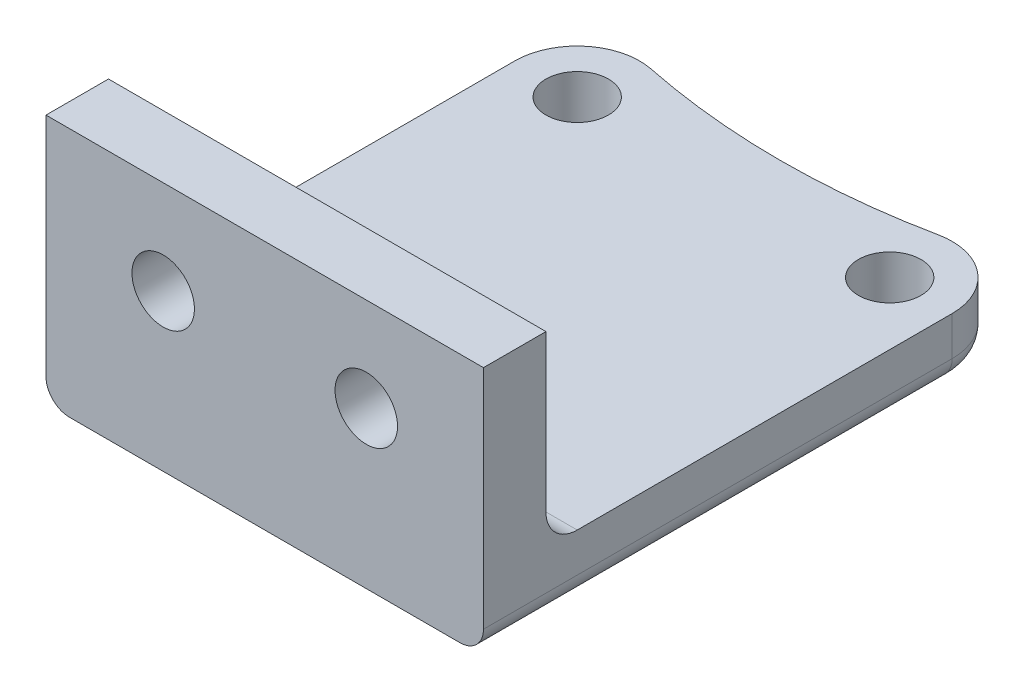
ISO-10303-21;
HEADER;
FILE_DESCRIPTION(('STEP AP214'),'2;1');
FILE_NAME('part.step','',(''),(''),'','','');
FILE_SCHEMA(('AUTOMOTIVE_DESIGN { 1 0 10303 214 1 1 1 1 }'));
ENDSEC;
DATA;
#1=APPLICATION_CONTEXT('core data for automotive mechanical design processes');
#2=APPLICATION_PROTOCOL_DEFINITION('international standard','automotive_design',2000,#1);
#3=PRODUCT_CONTEXT('',#1,'mechanical');
#4=PRODUCT('Part','Part','',(#3));
#5=PRODUCT_RELATED_PRODUCT_CATEGORY('part','',(#4));
#6=PRODUCT_DEFINITION_FORMATION('','',#4);
#7=PRODUCT_DEFINITION_CONTEXT('part definition',#1,'design');
#8=PRODUCT_DEFINITION('design','',#6,#7);
#9=PRODUCT_DEFINITION_SHAPE('','',#8);
#10=(LENGTH_UNIT() NAMED_UNIT(*) SI_UNIT(.MILLI.,.METRE.));
#11=(NAMED_UNIT(*) PLANE_ANGLE_UNIT() SI_UNIT($,.RADIAN.));
#12=(NAMED_UNIT(*) SI_UNIT($,.STERADIAN.) SOLID_ANGLE_UNIT());
#13=UNCERTAINTY_MEASURE_WITH_UNIT(LENGTH_MEASURE(1.E-05),#10,'distance_accuracy_value','');
#14=(GEOMETRIC_REPRESENTATION_CONTEXT(3) GLOBAL_UNCERTAINTY_ASSIGNED_CONTEXT((#13)) GLOBAL_UNIT_ASSIGNED_CONTEXT((#10,
#11,#12)) REPRESENTATION_CONTEXT('',''));
#15=CARTESIAN_POINT('',(0.,0.,0.));
#16=DIRECTION('',(0.,0.,1.));
#17=DIRECTION('',(1.,0.,0.));
#18=AXIS2_PLACEMENT_3D('',#15,#16,#17);
#19=CARTESIAN_POINT('',(10.,4.,-48.7662963080753));
#20=DIRECTION('',(0.,1.,0.));
#21=DIRECTION('',(0.,0.,-1.));
#22=AXIS2_PLACEMENT_3D('',#19,#20,#21);
#23=PLANE('',#22);
#24=DIRECTION('',(0.,0.,1.));
#25=VECTOR('',#24,1.);
#26=CARTESIAN_POINT('',(24.,4.,30.));
#27=LINE('',#26,#25);
#28=CARTESIAN_POINT('',(24.,4.,0.));
#29=VERTEX_POINT('',#28);
#30=CARTESIAN_POINT('',(24.,4.,24.));
#31=VERTEX_POINT('',#30);
#32=EDGE_CURVE('E182',#29,#31,#27,.T.);
#33=ORIENTED_EDGE('',*,*,#32,.F.);
#34=CARTESIAN_POINT('',(20.,4.,0.));
#35=DIRECTION('',(0.,-1.,0.));
#36=DIRECTION('',(0.,0.,-1.));
#37=AXIS2_PLACEMENT_3D('',#34,#35,#36);
#38=CIRCLE('',#37,4.);
#39=CARTESIAN_POINT('',(19.1964811839347,4.,-3.91846366733558));
#40=VERTEX_POINT('',#39);
#41=EDGE_CURVE('E179',#40,#29,#38,.T.);
#42=ORIENTED_EDGE('',*,*,#41,.F.);
#43=CARTESIAN_POINT('',(10.,4.,-48.7662963080753));
#44=DIRECTION('',(0.,1.,0.));
#45=DIRECTION('',(0.,0.,-1.));
#46=AXIS2_PLACEMENT_3D('',#43,#44,#45);
#47=CIRCLE('',#46,45.7810371085918);
#48=CARTESIAN_POINT('',(0.803518816065331,4.,-3.91846366733558));
#49=VERTEX_POINT('',#48);
#50=EDGE_CURVE('E176',#49,#40,#47,.T.);
#51=ORIENTED_EDGE('',*,*,#50,.F.);
#52=CARTESIAN_POINT('',(0.,4.,0.));
#53=DIRECTION('',(0.,-1.,0.));
#54=DIRECTION('',(0.,0.,-1.));
#55=AXIS2_PLACEMENT_3D('',#52,#53,#54);
#56=CIRCLE('',#55,4.);
#57=CARTESIAN_POINT('',(-4.,4.,0.));
#58=VERTEX_POINT('',#57);
#59=EDGE_CURVE('E187',#58,#49,#56,.T.);
#60=ORIENTED_EDGE('',*,*,#59,.F.);
#61=DIRECTION('',(0.,0.,-1.));
#62=VECTOR('',#61,1.);
#63=CARTESIAN_POINT('',(-4.,4.,0.));
#64=LINE('',#63,#62);
#65=CARTESIAN_POINT('',(-4.,4.,24.));
#66=VERTEX_POINT('',#65);
#67=EDGE_CURVE('E185',#66,#58,#64,.T.);
#68=ORIENTED_EDGE('',*,*,#67,.F.);
#69=DIRECTION('',(1.,0.,0.));
#70=VECTOR('',#69,1.);
#71=CARTESIAN_POINT('',(10.,4.,24.));
#72=LINE('',#71,#70);
#73=EDGE_CURVE('E246',#31,#66,#72,.F.);
#74=ORIENTED_EDGE('',*,*,#73,.F.);
#75=EDGE_LOOP('',(#33,#42,#51,#60,#68,#74));
#76=FACE_BOUND('',#75,.T.);
#77=CARTESIAN_POINT('',(0.,4.,0.));
#78=DIRECTION('',(0.,-1.,0.));
#79=DIRECTION('',(0.,0.,-1.));
#80=AXIS2_PLACEMENT_3D('',#77,#78,#79);
#81=CIRCLE('',#80,2.);
#82=CARTESIAN_POINT('',(0.,4.,-2.));
#83=VERTEX_POINT('',#82);
#84=EDGE_CURVE('E170',#83,#83,#81,.T.);
#85=ORIENTED_EDGE('',*,*,#84,.T.);
#86=EDGE_LOOP('',(#85));
#87=FACE_BOUND('',#86,.T.);
#88=CARTESIAN_POINT('',(20.,4.,0.));
#89=DIRECTION('',(0.,-1.,0.));
#90=DIRECTION('',(0.,0.,-1.));
#91=AXIS2_PLACEMENT_3D('',#88,#89,#90);
#92=CIRCLE('',#91,2.);
#93=CARTESIAN_POINT('',(20.,4.,-2.));
#94=VERTEX_POINT('',#93);
#95=EDGE_CURVE('E164',#94,#94,#92,.T.);
#96=ORIENTED_EDGE('',*,*,#95,.T.);
#97=EDGE_LOOP('',(#96));
#98=FACE_BOUND('',#97,.T.);
#99=ADVANCED_FACE('F35',(#76,#87,#98),#23,.T.);
#100=CARTESIAN_POINT('',(10.,0.,-48.7662963080753));
#101=DIRECTION('',(0.,1.,0.));
#102=DIRECTION('',(0.,0.,-1.));
#103=AXIS2_PLACEMENT_3D('',#100,#101,#102);
#104=PLANE('',#103);
#105=DIRECTION('',(-1.,0.,0.));
#106=VECTOR('',#105,1.);
#107=CARTESIAN_POINT('',(-4.,0.,30.));
#108=LINE('',#107,#106);
#109=CARTESIAN_POINT('',(22.5,0.,30.));
#110=VERTEX_POINT('',#109);
#111=CARTESIAN_POINT('',(-2.5,0.,30.));
#112=VERTEX_POINT('',#111);
#113=EDGE_CURVE('E173',#110,#112,#108,.T.);
#114=ORIENTED_EDGE('',*,*,#113,.T.);
#115=DIRECTION('',(0.,0.,-1.));
#116=VECTOR('',#115,1.);
#117=CARTESIAN_POINT('',(-2.5,0.,-48.7662963080753));
#118=LINE('',#117,#116);
#119=CARTESIAN_POINT('',(-2.5,0.,0.));
#120=VERTEX_POINT('',#119);
#121=EDGE_CURVE('E210',#120,#112,#118,.F.);
#122=ORIENTED_EDGE('',*,*,#121,.F.);
#123=CARTESIAN_POINT('',(0.,0.,0.));
#124=DIRECTION('',(0.,-1.,0.));
#125=DIRECTION('',(0.,0.,-1.));
#126=AXIS2_PLACEMENT_3D('',#123,#124,#125);
#127=CIRCLE('',#126,2.5);
#128=CARTESIAN_POINT('',(0.502199260040832,0.,-2.44903979208473));
#129=VERTEX_POINT('',#128);
#130=EDGE_CURVE('E213',#129,#120,#127,.F.);
#131=ORIENTED_EDGE('',*,*,#130,.F.);
#132=CARTESIAN_POINT('',(10.,0.,-48.7662963080753));
#133=DIRECTION('',(0.,-1.,0.));
#134=DIRECTION('',(0.,0.,-1.));
#135=AXIS2_PLACEMENT_3D('',#132,#133,#134);
#136=CIRCLE('',#135,47.2810371085918);
#137=CARTESIAN_POINT('',(19.4978007399592,0.,-2.44903979208473));
#138=VERTEX_POINT('',#137);
#139=EDGE_CURVE('E216',#138,#129,#136,.T.);
#140=ORIENTED_EDGE('',*,*,#139,.F.);
#141=CARTESIAN_POINT('',(20.,0.,0.));
#142=DIRECTION('',(0.,-1.,0.));
#143=DIRECTION('',(0.,0.,-1.));
#144=AXIS2_PLACEMENT_3D('',#141,#142,#143);
#145=CIRCLE('',#144,2.5);
#146=CARTESIAN_POINT('',(22.5,0.,0.));
#147=VERTEX_POINT('',#146);
#148=EDGE_CURVE('E219',#147,#138,#145,.F.);
#149=ORIENTED_EDGE('',*,*,#148,.F.);
#150=DIRECTION('',(0.,0.,1.));
#151=VECTOR('',#150,1.);
#152=CARTESIAN_POINT('',(22.5,0.,-48.7662963080753));
#153=LINE('',#152,#151);
#154=EDGE_CURVE('E222',#110,#147,#153,.F.);
#155=ORIENTED_EDGE('',*,*,#154,.F.);
#156=EDGE_LOOP('',(#114,#122,#131,#140,#149,#155));
#157=FACE_BOUND('',#156,.T.);
#158=CARTESIAN_POINT('',(0.,0.,0.));
#159=DIRECTION('',(0.,-1.,0.));
#160=DIRECTION('',(0.,0.,-1.));
#161=AXIS2_PLACEMENT_3D('',#158,#159,#160);
#162=CIRCLE('',#161,2.);
#163=CARTESIAN_POINT('',(0.,0.,-2.));
#164=VERTEX_POINT('',#163);
#165=EDGE_CURVE('E167',#164,#164,#162,.T.);
#166=ORIENTED_EDGE('',*,*,#165,.F.);
#167=EDGE_LOOP('',(#166));
#168=FACE_BOUND('',#167,.T.);
#169=CARTESIAN_POINT('',(20.,0.,0.));
#170=DIRECTION('',(0.,-1.,0.));
#171=DIRECTION('',(0.,0.,-1.));
#172=AXIS2_PLACEMENT_3D('',#169,#170,#171);
#173=CIRCLE('',#172,2.);
#174=CARTESIAN_POINT('',(20.,0.,-2.));
#175=VERTEX_POINT('',#174);
#176=EDGE_CURVE('E163',#175,#175,#173,.T.);
#177=ORIENTED_EDGE('',*,*,#176,.F.);
#178=EDGE_LOOP('',(#177));
#179=FACE_BOUND('',#178,.T.);
#180=ADVANCED_FACE('F264',(#157,#168,#179),#104,.F.);
#181=CARTESIAN_POINT('',(10.,4.,-48.7662963080753));
#182=DIRECTION('',(0.,-1.,0.));
#183=DIRECTION('',(0.,0.,1.));
#184=AXIS2_PLACEMENT_3D('',#181,#182,#183);
#185=CYLINDRICAL_SURFACE('',#184,45.7810371085918);
#186=DIRECTION('',(0.,-1.,0.));
#187=VECTOR('',#186,1.);
#188=CARTESIAN_POINT('',(0.803518816065331,4.,-3.91846366733558));
#189=LINE('',#188,#187);
#190=CARTESIAN_POINT('',(0.803518816065331,1.5,-3.91846366733558));
#191=VERTEX_POINT('',#190);
#192=EDGE_CURVE('E190',#49,#191,#189,.T.);
#193=ORIENTED_EDGE('',*,*,#192,.F.);
#194=ORIENTED_EDGE('',*,*,#50,.T.);
#195=DIRECTION('',(0.,-1.,0.));
#196=VECTOR('',#195,1.);
#197=CARTESIAN_POINT('',(19.1964811839347,4.,-3.91846366733558));
#198=LINE('',#197,#196);
#199=CARTESIAN_POINT('',(19.1964811839347,1.5,-3.91846366733558));
#200=VERTEX_POINT('',#199);
#201=EDGE_CURVE('E200',#40,#200,#198,.T.);
#202=ORIENTED_EDGE('',*,*,#201,.T.);
#203=CARTESIAN_POINT('',(10.,1.5,-48.7662963080753));
#204=DIRECTION('',(0.,-1.,0.));
#205=DIRECTION('',(0.,0.,-1.));
#206=AXIS2_PLACEMENT_3D('',#203,#204,#205);
#207=CIRCLE('',#206,45.7810371085918);
#208=EDGE_CURVE('E228',#191,#200,#207,.F.);
#209=ORIENTED_EDGE('',*,*,#208,.F.);
#210=EDGE_LOOP('',(#193,#194,#202,#209));
#211=FACE_BOUND('',#210,.T.);
#212=ADVANCED_FACE('F297',(#211),#185,.F.);
#213=CARTESIAN_POINT('',(20.,4.,0.));
#214=DIRECTION('',(0.,-1.,0.));
#215=DIRECTION('',(0.,0.,1.));
#216=AXIS2_PLACEMENT_3D('',#213,#214,#215);
#217=CYLINDRICAL_SURFACE('',#216,4.);
#218=ORIENTED_EDGE('',*,*,#201,.F.);
#219=ORIENTED_EDGE('',*,*,#41,.T.);
#220=DIRECTION('',(0.,-1.,0.));
#221=VECTOR('',#220,1.);
#222=CARTESIAN_POINT('',(24.,4.,0.));
#223=LINE('',#222,#221);
#224=CARTESIAN_POINT('',(24.,1.5,0.));
#225=VERTEX_POINT('',#224);
#226=EDGE_CURVE('E197',#29,#225,#223,.T.);
#227=ORIENTED_EDGE('',*,*,#226,.T.);
#228=CARTESIAN_POINT('',(20.,1.5,0.));
#229=DIRECTION('',(0.,-1.,0.));
#230=DIRECTION('',(0.,0.,-1.));
#231=AXIS2_PLACEMENT_3D('',#228,#229,#230);
#232=CIRCLE('',#231,4.);
#233=EDGE_CURVE('E225',#200,#225,#232,.T.);
#234=ORIENTED_EDGE('',*,*,#233,.F.);
#235=EDGE_LOOP('',(#218,#219,#227,#234));
#236=FACE_BOUND('',#235,.T.);
#237=ADVANCED_FACE('F310',(#236),#217,.T.);
#238=CARTESIAN_POINT('',(24.,4.,30.));
#239=DIRECTION('',(-1.,0.,0.));
#240=DIRECTION('',(0.,0.,-1.));
#241=AXIS2_PLACEMENT_3D('',#238,#239,#240);
#242=PLANE('',#241);
#243=ORIENTED_EDGE('',*,*,#226,.F.);
#244=ORIENTED_EDGE('',*,*,#32,.T.);
#245=CARTESIAN_POINT('',(24.,6.,24.));
#246=DIRECTION('',(1.,0.,0.));
#247=DIRECTION('',(0.,0.,-1.));
#248=AXIS2_PLACEMENT_3D('',#245,#246,#247);
#249=CIRCLE('',#248,2.);
#250=CARTESIAN_POINT('',(24.,6.,26.));
#251=VERTEX_POINT('',#250);
#252=EDGE_CURVE('E43',#251,#31,#249,.T.);
#253=ORIENTED_EDGE('',*,*,#252,.F.);
#254=DIRECTION('',(0.,-1.,0.));
#255=VECTOR('',#254,1.);
#256=CARTESIAN_POINT('',(24.,16.,26.));
#257=LINE('',#256,#255);
#258=CARTESIAN_POINT('',(24.,16.,26.));
#259=VERTEX_POINT('',#258);
#260=EDGE_CURVE('E158',#259,#251,#257,.T.);
#261=ORIENTED_EDGE('',*,*,#260,.F.);
#262=DIRECTION('',(0.,0.,1.));
#263=VECTOR('',#262,1.);
#264=CARTESIAN_POINT('',(24.,16.,26.));
#265=LINE('',#264,#263);
#266=CARTESIAN_POINT('',(24.,16.,30.));
#267=VERTEX_POINT('',#266);
#268=EDGE_CURVE('E156',#259,#267,#265,.T.);
#269=ORIENTED_EDGE('',*,*,#268,.T.);
#270=DIRECTION('',(0.,-1.,0.));
#271=VECTOR('',#270,1.);
#272=CARTESIAN_POINT('',(24.,4.,30.));
#273=LINE('',#272,#271);
#274=CARTESIAN_POINT('',(24.,1.5,30.));
#275=VERTEX_POINT('',#274);
#276=EDGE_CURVE('E140',#267,#275,#273,.T.);
#277=ORIENTED_EDGE('',*,*,#276,.T.);
#278=DIRECTION('',(0.,0.,1.));
#279=VECTOR('',#278,1.);
#280=CARTESIAN_POINT('',(24.,1.5,30.));
#281=LINE('',#280,#279);
#282=EDGE_CURVE('E203',#225,#275,#281,.T.);
#283=ORIENTED_EDGE('',*,*,#282,.F.);
#284=EDGE_LOOP('',(#243,#244,#253,#261,#269,#277,#283));
#285=FACE_BOUND('',#284,.T.);
#286=ADVANCED_FACE('F273',(#285),#242,.F.);
#287=CARTESIAN_POINT('',(-4.,4.,30.));
#288=DIRECTION('',(0.,0.,-1.));
#289=DIRECTION('',(1.,0.,0.));
#290=AXIS2_PLACEMENT_3D('',#287,#288,#289);
#291=PLANE('',#290);
#292=CARTESIAN_POINT('',(3.5,10.,30.));
#293=DIRECTION('',(0.,0.,1.));
#294=DIRECTION('',(1.,0.,0.));
#295=AXIS2_PLACEMENT_3D('',#292,#293,#294);
#296=CIRCLE('',#295,2.);
#297=CARTESIAN_POINT('',(5.5,10.,30.));
#298=VERTEX_POINT('',#297);
#299=EDGE_CURVE('E146',#298,#298,#296,.F.);
#300=ORIENTED_EDGE('',*,*,#299,.T.);
#301=EDGE_LOOP('',(#300));
#302=FACE_BOUND('',#301,.T.);
#303=CARTESIAN_POINT('',(16.5,10.,30.));
#304=DIRECTION('',(0.,0.,1.));
#305=DIRECTION('',(1.,0.,0.));
#306=AXIS2_PLACEMENT_3D('',#303,#304,#305);
#307=CIRCLE('',#306,2.);
#308=CARTESIAN_POINT('',(18.5,10.,30.));
#309=VERTEX_POINT('',#308);
#310=EDGE_CURVE('E152',#309,#309,#307,.F.);
#311=ORIENTED_EDGE('',*,*,#310,.T.);
#312=EDGE_LOOP('',(#311));
#313=FACE_BOUND('',#312,.T.);
#314=ORIENTED_EDGE('',*,*,#276,.F.);
#315=DIRECTION('',(-1.,0.,0.));
#316=VECTOR('',#315,1.);
#317=CARTESIAN_POINT('',(24.,16.,30.));
#318=LINE('',#317,#316);
#319=CARTESIAN_POINT('',(-4.,16.,30.));
#320=VERTEX_POINT('',#319);
#321=EDGE_CURVE('E127',#267,#320,#318,.T.);
#322=ORIENTED_EDGE('',*,*,#321,.T.);
#323=DIRECTION('',(0.,-1.,0.));
#324=VECTOR('',#323,1.);
#325=CARTESIAN_POINT('',(-4.,4.,30.));
#326=LINE('',#325,#324);
#327=CARTESIAN_POINT('',(-4.,1.5,30.));
#328=VERTEX_POINT('',#327);
#329=EDGE_CURVE('E133',#320,#328,#326,.T.);
#330=ORIENTED_EDGE('',*,*,#329,.T.);
#331=CARTESIAN_POINT('',(-2.5,1.5,30.));
#332=DIRECTION('',(0.,0.,1.));
#333=DIRECTION('',(1.,0.,0.));
#334=AXIS2_PLACEMENT_3D('',#331,#332,#333);
#335=CIRCLE('',#334,1.5);
#336=EDGE_CURVE('E206',#112,#328,#335,.F.);
#337=ORIENTED_EDGE('',*,*,#336,.F.);
#338=ORIENTED_EDGE('',*,*,#113,.F.);
#339=CARTESIAN_POINT('',(22.5,1.5,30.));
#340=DIRECTION('',(0.,0.,1.));
#341=DIRECTION('',(1.,0.,0.));
#342=AXIS2_PLACEMENT_3D('',#339,#340,#341);
#343=CIRCLE('',#342,1.5);
#344=EDGE_CURVE('E208',#275,#110,#343,.F.);
#345=ORIENTED_EDGE('',*,*,#344,.F.);
#346=EDGE_LOOP('',(#314,#322,#330,#337,#338,#345));
#347=FACE_BOUND('',#346,.T.);
#348=ADVANCED_FACE('F143',(#302,#313,#347),#291,.F.);
#349=CARTESIAN_POINT('',(-4.,4.,0.));
#350=DIRECTION('',(1.,0.,0.));
#351=DIRECTION('',(0.,0.,1.));
#352=AXIS2_PLACEMENT_3D('',#349,#350,#351);
#353=PLANE('',#352);
#354=ORIENTED_EDGE('',*,*,#329,.F.);
#355=DIRECTION('',(0.,0.,-1.));
#356=VECTOR('',#355,1.);
#357=CARTESIAN_POINT('',(-4.,16.,30.));
#358=LINE('',#357,#356);
#359=CARTESIAN_POINT('',(-4.,16.,26.));
#360=VERTEX_POINT('',#359);
#361=EDGE_CURVE('E122',#320,#360,#358,.T.);
#362=ORIENTED_EDGE('',*,*,#361,.T.);
#363=DIRECTION('',(0.,-1.,0.));
#364=VECTOR('',#363,1.);
#365=CARTESIAN_POINT('',(-4.,16.,26.));
#366=LINE('',#365,#364);
#367=CARTESIAN_POINT('',(-4.,6.,26.));
#368=VERTEX_POINT('',#367);
#369=EDGE_CURVE('E161',#360,#368,#366,.T.);
#370=ORIENTED_EDGE('',*,*,#369,.T.);
#371=CARTESIAN_POINT('',(-4.,6.,24.));
#372=DIRECTION('',(-1.,0.,0.));
#373=DIRECTION('',(0.,0.,1.));
#374=AXIS2_PLACEMENT_3D('',#371,#372,#373);
#375=CIRCLE('',#374,2.);
#376=EDGE_CURVE('E11',#66,#368,#375,.T.);
#377=ORIENTED_EDGE('',*,*,#376,.F.);
#378=ORIENTED_EDGE('',*,*,#67,.T.);
#379=DIRECTION('',(0.,-1.,0.));
#380=VECTOR('',#379,1.);
#381=CARTESIAN_POINT('',(-4.,4.,0.));
#382=LINE('',#381,#380);
#383=CARTESIAN_POINT('',(-4.,1.5,0.));
#384=VERTEX_POINT('',#383);
#385=EDGE_CURVE('E141',#58,#384,#382,.T.);
#386=ORIENTED_EDGE('',*,*,#385,.T.);
#387=DIRECTION('',(0.,0.,-1.));
#388=VECTOR('',#387,1.);
#389=CARTESIAN_POINT('',(-4.,1.5,0.));
#390=LINE('',#389,#388);
#391=EDGE_CURVE('E137',#328,#384,#390,.T.);
#392=ORIENTED_EDGE('',*,*,#391,.F.);
#393=EDGE_LOOP('',(#354,#362,#370,#377,#378,#386,#392));
#394=FACE_BOUND('',#393,.T.);
#395=ADVANCED_FACE('F134',(#394),#353,.F.);
#396=CARTESIAN_POINT('',(0.,4.,0.));
#397=DIRECTION('',(0.,-1.,0.));
#398=DIRECTION('',(0.,0.,1.));
#399=AXIS2_PLACEMENT_3D('',#396,#397,#398);
#400=CYLINDRICAL_SURFACE('',#399,4.);
#401=ORIENTED_EDGE('',*,*,#385,.F.);
#402=ORIENTED_EDGE('',*,*,#59,.T.);
#403=ORIENTED_EDGE('',*,*,#192,.T.);
#404=CARTESIAN_POINT('',(0.,1.5,0.));
#405=DIRECTION('',(0.,-1.,0.));
#406=DIRECTION('',(0.,0.,-1.));
#407=AXIS2_PLACEMENT_3D('',#404,#405,#406);
#408=CIRCLE('',#407,4.);
#409=EDGE_CURVE('E231',#384,#191,#408,.T.);
#410=ORIENTED_EDGE('',*,*,#409,.F.);
#411=EDGE_LOOP('',(#401,#402,#403,#410));
#412=FACE_BOUND('',#411,.T.);
#413=ADVANCED_FACE('F255',(#412),#400,.T.);
#414=CARTESIAN_POINT('',(0.,4.,0.));
#415=DIRECTION('',(0.,-1.,0.));
#416=DIRECTION('',(0.,0.,1.));
#417=AXIS2_PLACEMENT_3D('',#414,#415,#416);
#418=CYLINDRICAL_SURFACE('',#417,2.);
#419=ORIENTED_EDGE('',*,*,#84,.F.);
#420=EDGE_LOOP('',(#419));
#421=FACE_BOUND('',#420,.T.);
#422=ORIENTED_EDGE('',*,*,#165,.T.);
#423=EDGE_LOOP('',(#422));
#424=FACE_BOUND('',#423,.T.);
#425=ADVANCED_FACE('F287',(#421,#424),#418,.F.);
#426=CARTESIAN_POINT('',(20.,4.,0.));
#427=DIRECTION('',(0.,-1.,0.));
#428=DIRECTION('',(0.,0.,1.));
#429=AXIS2_PLACEMENT_3D('',#426,#427,#428);
#430=CYLINDRICAL_SURFACE('',#429,2.);
#431=ORIENTED_EDGE('',*,*,#95,.F.);
#432=EDGE_LOOP('',(#431));
#433=FACE_BOUND('',#432,.T.);
#434=ORIENTED_EDGE('',*,*,#176,.T.);
#435=EDGE_LOOP('',(#434));
#436=FACE_BOUND('',#435,.T.);
#437=ADVANCED_FACE('F278',(#433,#436),#430,.F.);
#438=CARTESIAN_POINT('',(-4.,16.,26.));
#439=DIRECTION('',(0.,0.,1.));
#440=DIRECTION('',(-1.,0.,0.));
#441=AXIS2_PLACEMENT_3D('',#438,#439,#440);
#442=PLANE('',#441);
#443=CARTESIAN_POINT('',(3.5,10.,26.));
#444=DIRECTION('',(0.,0.,1.));
#445=DIRECTION('',(1.,0.,0.));
#446=AXIS2_PLACEMENT_3D('',#443,#444,#445);
#447=CIRCLE('',#446,2.);
#448=CARTESIAN_POINT('',(5.5,10.,26.));
#449=VERTEX_POINT('',#448);
#450=EDGE_CURVE('E149',#449,#449,#447,.T.);
#451=ORIENTED_EDGE('',*,*,#450,.T.);
#452=EDGE_LOOP('',(#451));
#453=FACE_BOUND('',#452,.T.);
#454=CARTESIAN_POINT('',(16.5,10.,26.));
#455=DIRECTION('',(0.,0.,1.));
#456=DIRECTION('',(1.,0.,0.));
#457=AXIS2_PLACEMENT_3D('',#454,#455,#456);
#458=CIRCLE('',#457,2.);
#459=CARTESIAN_POINT('',(18.5,10.,26.));
#460=VERTEX_POINT('',#459);
#461=EDGE_CURVE('E244',#460,#460,#458,.T.);
#462=ORIENTED_EDGE('',*,*,#461,.T.);
#463=EDGE_LOOP('',(#462));
#464=FACE_BOUND('',#463,.T.);
#465=ORIENTED_EDGE('',*,*,#369,.F.);
#466=DIRECTION('',(1.,0.,0.));
#467=VECTOR('',#466,1.);
#468=CARTESIAN_POINT('',(-4.,16.,26.));
#469=LINE('',#468,#467);
#470=EDGE_CURVE('E129',#360,#259,#469,.T.);
#471=ORIENTED_EDGE('',*,*,#470,.T.);
#472=ORIENTED_EDGE('',*,*,#260,.T.);
#473=DIRECTION('',(1.,0.,0.));
#474=VECTOR('',#473,1.);
#475=CARTESIAN_POINT('',(-4.,6.,26.));
#476=LINE('',#475,#474);
#477=EDGE_CURVE('E235',#368,#251,#476,.T.);
#478=ORIENTED_EDGE('',*,*,#477,.F.);
#479=EDGE_LOOP('',(#465,#471,#472,#478));
#480=FACE_BOUND('',#479,.T.);
#481=ADVANCED_FACE('F276',(#453,#464,#480),#442,.F.);
#482=CARTESIAN_POINT('',(0.,16.,0.));
#483=DIRECTION('',(0.,1.,0.));
#484=DIRECTION('',(0.,0.,-1.));
#485=AXIS2_PLACEMENT_3D('',#482,#483,#484);
#486=PLANE('',#485);
#487=ORIENTED_EDGE('',*,*,#321,.F.);
#488=ORIENTED_EDGE('',*,*,#268,.F.);
#489=ORIENTED_EDGE('',*,*,#470,.F.);
#490=ORIENTED_EDGE('',*,*,#361,.F.);
#491=EDGE_LOOP('',(#487,#488,#489,#490));
#492=FACE_BOUND('',#491,.T.);
#493=ADVANCED_FACE('F124',(#492),#486,.T.);
#494=CARTESIAN_POINT('',(16.5,10.,35.6568542494924));
#495=DIRECTION('',(0.,0.,-1.));
#496=DIRECTION('',(1.,0.,0.));
#497=AXIS2_PLACEMENT_3D('',#494,#495,#496);
#498=CYLINDRICAL_SURFACE('',#497,2.);
#499=ORIENTED_EDGE('',*,*,#310,.F.);
#500=EDGE_LOOP('',(#499));
#501=FACE_BOUND('',#500,.T.);
#502=ORIENTED_EDGE('',*,*,#461,.F.);
#503=EDGE_LOOP('',(#502));
#504=FACE_BOUND('',#503,.T.);
#505=ADVANCED_FACE('F285',(#501,#504),#498,.F.);
#506=CARTESIAN_POINT('',(3.5,10.,35.6568542494924));
#507=DIRECTION('',(0.,0.,-1.));
#508=DIRECTION('',(1.,0.,0.));
#509=AXIS2_PLACEMENT_3D('',#506,#507,#508);
#510=CYLINDRICAL_SURFACE('',#509,2.);
#511=ORIENTED_EDGE('',*,*,#299,.F.);
#512=EDGE_LOOP('',(#511));
#513=FACE_BOUND('',#512,.T.);
#514=ORIENTED_EDGE('',*,*,#450,.F.);
#515=EDGE_LOOP('',(#514));
#516=FACE_BOUND('',#515,.T.);
#517=ADVANCED_FACE('F330',(#513,#516),#510,.F.);
#518=CARTESIAN_POINT('',(-2.5,1.5,0.));
#519=DIRECTION('',(0.,0.,-1.));
#520=DIRECTION('',(1.,0.,0.));
#521=AXIS2_PLACEMENT_3D('',#518,#519,#520);
#522=CYLINDRICAL_SURFACE('',#521,1.5);
#523=ORIENTED_EDGE('',*,*,#336,.T.);
#524=ORIENTED_EDGE('',*,*,#391,.T.);
#525=CARTESIAN_POINT('',(-2.5,1.5,0.));
#526=DIRECTION('',(0.,0.,1.));
#527=DIRECTION('',(0.,-1.,0.));
#528=AXIS2_PLACEMENT_3D('',#525,#526,#527);
#529=CIRCLE('',#528,1.5);
#530=EDGE_CURVE('E242',#384,#120,#529,.T.);
#531=ORIENTED_EDGE('',*,*,#530,.T.);
#532=ORIENTED_EDGE('',*,*,#121,.T.);
#533=EDGE_LOOP('',(#523,#524,#531,#532));
#534=FACE_BOUND('',#533,.T.);
#535=ADVANCED_FACE('F259',(#534),#522,.T.);
#536=CARTESIAN_POINT('',(0.,1.5,0.));
#537=DIRECTION('',(0.,1.,0.));
#538=DIRECTION('',(0.,0.,-1.));
#539=AXIS2_PLACEMENT_3D('',#536,#537,#538);
#540=TOROIDAL_SURFACE('',#539,2.5,1.5);
#541=ORIENTED_EDGE('',*,*,#530,.F.);
#542=ORIENTED_EDGE('',*,*,#409,.T.);
#543=CARTESIAN_POINT('',(0.502199260040832,1.5,-2.44903979208473));
#544=DIRECTION('',(-0.979615916833894,0.,-0.200879704016333));
#545=DIRECTION('',(-0.200879704016333,0.,0.979615916833894));
#546=AXIS2_PLACEMENT_3D('',#543,#544,#545);
#547=CIRCLE('',#546,1.5);
#548=EDGE_CURVE('E240',#191,#129,#547,.T.);
#549=ORIENTED_EDGE('',*,*,#548,.T.);
#550=ORIENTED_EDGE('',*,*,#130,.T.);
#551=EDGE_LOOP('',(#541,#542,#549,#550));
#552=FACE_BOUND('',#551,.T.);
#553=ADVANCED_FACE('F326',(#552),#540,.T.);
#554=CARTESIAN_POINT('',(10.,1.5,-48.7662963080753));
#555=DIRECTION('',(0.,1.,0.));
#556=DIRECTION('',(0.,0.,-1.));
#557=AXIS2_PLACEMENT_3D('',#554,#555,#556);
#558=TOROIDAL_SURFACE('',#557,47.2810371085918,1.5);
#559=ORIENTED_EDGE('',*,*,#548,.F.);
#560=ORIENTED_EDGE('',*,*,#208,.T.);
#561=CARTESIAN_POINT('',(19.4978007399592,1.5,-2.44903979208473));
#562=DIRECTION('',(-0.979615916833894,0.,0.200879704016332));
#563=DIRECTION('',(0.200879704016332,0.,0.979615916833894));
#564=AXIS2_PLACEMENT_3D('',#561,#562,#563);
#565=CIRCLE('',#564,1.5);
#566=EDGE_CURVE('E238',#200,#138,#565,.T.);
#567=ORIENTED_EDGE('',*,*,#566,.T.);
#568=ORIENTED_EDGE('',*,*,#139,.T.);
#569=EDGE_LOOP('',(#559,#560,#567,#568));
#570=FACE_BOUND('',#569,.T.);
#571=ADVANCED_FACE('F322',(#570),#558,.T.);
#572=CARTESIAN_POINT('',(20.,1.5,0.));
#573=DIRECTION('',(0.,1.,0.));
#574=DIRECTION('',(0.,0.,-1.));
#575=AXIS2_PLACEMENT_3D('',#572,#573,#574);
#576=TOROIDAL_SURFACE('',#575,2.5,1.5);
#577=ORIENTED_EDGE('',*,*,#566,.F.);
#578=ORIENTED_EDGE('',*,*,#233,.T.);
#579=CARTESIAN_POINT('',(22.5,1.5,0.));
#580=DIRECTION('',(0.,0.,-1.));
#581=DIRECTION('',(-1.,0.,0.));
#582=AXIS2_PLACEMENT_3D('',#579,#580,#581);
#583=CIRCLE('',#582,1.5);
#584=EDGE_CURVE('E236',#225,#147,#583,.T.);
#585=ORIENTED_EDGE('',*,*,#584,.T.);
#586=ORIENTED_EDGE('',*,*,#148,.T.);
#587=EDGE_LOOP('',(#577,#578,#585,#586));
#588=FACE_BOUND('',#587,.T.);
#589=ADVANCED_FACE('F319',(#588),#576,.T.);
#590=CARTESIAN_POINT('',(22.5,1.5,30.));
#591=DIRECTION('',(0.,0.,1.));
#592=DIRECTION('',(-1.,0.,0.));
#593=AXIS2_PLACEMENT_3D('',#590,#591,#592);
#594=CYLINDRICAL_SURFACE('',#593,1.5);
#595=ORIENTED_EDGE('',*,*,#584,.F.);
#596=ORIENTED_EDGE('',*,*,#282,.T.);
#597=ORIENTED_EDGE('',*,*,#344,.T.);
#598=ORIENTED_EDGE('',*,*,#154,.T.);
#599=EDGE_LOOP('',(#595,#596,#597,#598));
#600=FACE_BOUND('',#599,.T.);
#601=ADVANCED_FACE('F270',(#600),#594,.T.);
#602=CARTESIAN_POINT('',(-4.,6.,24.));
#603=DIRECTION('',(1.,0.,0.));
#604=DIRECTION('',(0.,0.,1.));
#605=AXIS2_PLACEMENT_3D('',#602,#603,#604);
#606=CYLINDRICAL_SURFACE('',#605,2.);
#607=ORIENTED_EDGE('',*,*,#376,.T.);
#608=ORIENTED_EDGE('',*,*,#477,.T.);
#609=ORIENTED_EDGE('',*,*,#252,.T.);
#610=ORIENTED_EDGE('',*,*,#73,.T.);
#611=EDGE_LOOP('',(#607,#608,#609,#610));
#612=FACE_BOUND('',#611,.T.);
#613=ADVANCED_FACE('F37',(#612),#606,.F.);
#614=CLOSED_SHELL('',(#99,#180,#212,#237,#286,#348,#395,#413,#425,#437,#481,#493,#505,#517,#535,
#553,#571,#589,#601,#613));
#615=MANIFOLD_SOLID_BREP('B2',#614);
#616=ADVANCED_BREP_SHAPE_REPRESENTATION('',(#18,#615),#14);
#617=SHAPE_DEFINITION_REPRESENTATION(#9,#616);
ENDSEC;
END-ISO-10303-21;
